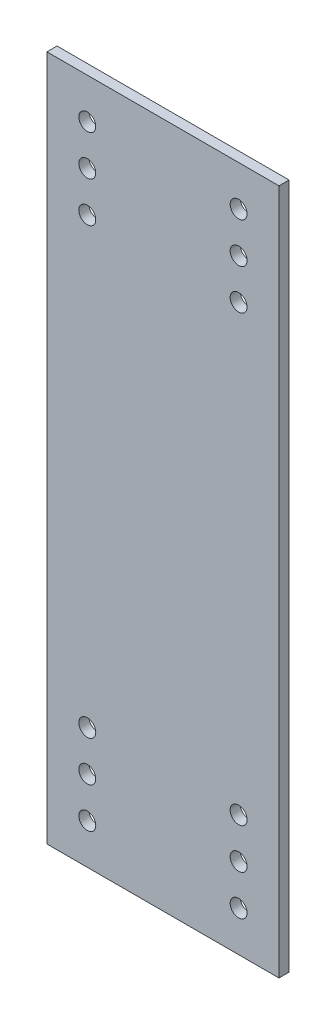
ISO-10303-21;
HEADER;
FILE_DESCRIPTION(('STEP AP214'),'2;1');
FILE_NAME('part.step','',(''),(''),'','','');
FILE_SCHEMA(('AUTOMOTIVE_DESIGN { 1 0 10303 214 1 1 1 1 }'));
ENDSEC;
DATA;
#1=APPLICATION_CONTEXT('core data for automotive mechanical design processes');
#2=APPLICATION_PROTOCOL_DEFINITION('international standard','automotive_design',2000,#1);
#3=PRODUCT_CONTEXT('',#1,'mechanical');
#4=PRODUCT('Part','Part','',(#3));
#5=PRODUCT_RELATED_PRODUCT_CATEGORY('part','',(#4));
#6=PRODUCT_DEFINITION_FORMATION('','',#4);
#7=PRODUCT_DEFINITION_CONTEXT('part definition',#1,'design');
#8=PRODUCT_DEFINITION('design','',#6,#7);
#9=PRODUCT_DEFINITION_SHAPE('','',#8);
#10=(LENGTH_UNIT() NAMED_UNIT(*) SI_UNIT(.MILLI.,.METRE.));
#11=(NAMED_UNIT(*) PLANE_ANGLE_UNIT() SI_UNIT($,.RADIAN.));
#12=(NAMED_UNIT(*) SI_UNIT($,.STERADIAN.) SOLID_ANGLE_UNIT());
#13=UNCERTAINTY_MEASURE_WITH_UNIT(LENGTH_MEASURE(1.E-05),#10,'distance_accuracy_value','');
#14=(GEOMETRIC_REPRESENTATION_CONTEXT(3) GLOBAL_UNCERTAINTY_ASSIGNED_CONTEXT((#13)) GLOBAL_UNIT_ASSIGNED_CONTEXT((#10,
#11,#12)) REPRESENTATION_CONTEXT('',''));
#15=CARTESIAN_POINT('',(0.,0.,0.));
#16=DIRECTION('',(0.,0.,1.));
#17=DIRECTION('',(1.,0.,0.));
#18=AXIS2_PLACEMENT_3D('',#15,#16,#17);
#19=CARTESIAN_POINT('',(36.5125,107.95,3.175));
#20=DIRECTION('',(-1.,0.,0.));
#21=DIRECTION('',(0.,-1.,0.));
#22=AXIS2_PLACEMENT_3D('',#19,#20,#21);
#23=PLANE('',#22);
#24=DIRECTION('',(0.,1.,0.));
#25=VECTOR('',#24,1.);
#26=CARTESIAN_POINT('',(36.5125,107.95,0.));
#27=LINE('',#26,#25);
#28=CARTESIAN_POINT('',(36.5125,-107.95,0.));
#29=VERTEX_POINT('',#28);
#30=CARTESIAN_POINT('',(36.5125,107.95,0.));
#31=VERTEX_POINT('',#30);
#32=EDGE_CURVE('E103',#29,#31,#27,.T.);
#33=ORIENTED_EDGE('',*,*,#32,.T.);
#34=DIRECTION('',(0.,0.,-1.));
#35=VECTOR('',#34,1.);
#36=CARTESIAN_POINT('',(36.5125,107.95,3.175));
#37=LINE('',#36,#35);
#38=CARTESIAN_POINT('',(36.5125,107.95,3.175));
#39=VERTEX_POINT('',#38);
#40=EDGE_CURVE('E11',#39,#31,#37,.T.);
#41=ORIENTED_EDGE('',*,*,#40,.F.);
#42=DIRECTION('',(0.,1.,0.));
#43=VECTOR('',#42,1.);
#44=CARTESIAN_POINT('',(36.5125,107.95,3.175));
#45=LINE('',#44,#43);
#46=CARTESIAN_POINT('',(36.5125,-107.95,3.175));
#47=VERTEX_POINT('',#46);
#48=EDGE_CURVE('E91',#47,#39,#45,.T.);
#49=ORIENTED_EDGE('',*,*,#48,.F.);
#50=DIRECTION('',(0.,0.,-1.));
#51=VECTOR('',#50,1.);
#52=CARTESIAN_POINT('',(36.5125,-107.95,3.175));
#53=LINE('',#52,#51);
#54=EDGE_CURVE('E99',#47,#29,#53,.T.);
#55=ORIENTED_EDGE('',*,*,#54,.T.);
#56=EDGE_LOOP('',(#33,#41,#49,#55));
#57=FACE_BOUND('',#56,.T.);
#58=ADVANCED_FACE('F40',(#57),#23,.F.);
#59=CARTESIAN_POINT('',(-36.5125,107.95,3.175));
#60=DIRECTION('',(0.,-1.,0.));
#61=DIRECTION('',(0.,0.,-1.));
#62=AXIS2_PLACEMENT_3D('',#59,#60,#61);
#63=PLANE('',#62);
#64=DIRECTION('',(-1.,0.,0.));
#65=VECTOR('',#64,1.);
#66=CARTESIAN_POINT('',(-36.5125,107.95,0.));
#67=LINE('',#66,#65);
#68=CARTESIAN_POINT('',(-36.5125,107.95,0.));
#69=VERTEX_POINT('',#68);
#70=EDGE_CURVE('E95',#31,#69,#67,.T.);
#71=ORIENTED_EDGE('',*,*,#70,.T.);
#72=DIRECTION('',(0.,0.,-1.));
#73=VECTOR('',#72,1.);
#74=CARTESIAN_POINT('',(-36.5125,107.95,3.175));
#75=LINE('',#74,#73);
#76=CARTESIAN_POINT('',(-36.5125,107.95,3.175));
#77=VERTEX_POINT('',#76);
#78=EDGE_CURVE('E48',#77,#69,#75,.T.);
#79=ORIENTED_EDGE('',*,*,#78,.F.);
#80=DIRECTION('',(-1.,0.,0.));
#81=VECTOR('',#80,1.);
#82=CARTESIAN_POINT('',(-36.5125,107.95,3.175));
#83=LINE('',#82,#81);
#84=EDGE_CURVE('E86',#39,#77,#83,.T.);
#85=ORIENTED_EDGE('',*,*,#84,.F.);
#86=ORIENTED_EDGE('',*,*,#40,.T.);
#87=EDGE_LOOP('',(#71,#79,#85,#86));
#88=FACE_BOUND('',#87,.T.);
#89=ADVANCED_FACE('F94',(#88),#63,.F.);
#90=CARTESIAN_POINT('',(-36.5125,107.95,3.175));
#91=DIRECTION('',(1.,0.,0.));
#92=DIRECTION('',(0.,1.,0.));
#93=AXIS2_PLACEMENT_3D('',#90,#91,#92);
#94=PLANE('',#93);
#95=DIRECTION('',(0.,-1.,0.));
#96=VECTOR('',#95,1.);
#97=CARTESIAN_POINT('',(-36.5125,107.95,0.));
#98=LINE('',#97,#96);
#99=CARTESIAN_POINT('',(-36.5125,-107.95,0.));
#100=VERTEX_POINT('',#99);
#101=EDGE_CURVE('E73',#69,#100,#98,.T.);
#102=ORIENTED_EDGE('',*,*,#101,.T.);
#103=DIRECTION('',(0.,0.,-1.));
#104=VECTOR('',#103,1.);
#105=CARTESIAN_POINT('',(-36.5125,-107.95,3.175));
#106=LINE('',#105,#104);
#107=CARTESIAN_POINT('',(-36.5125,-107.95,3.175));
#108=VERTEX_POINT('',#107);
#109=EDGE_CURVE('E96',#108,#100,#106,.T.);
#110=ORIENTED_EDGE('',*,*,#109,.F.);
#111=DIRECTION('',(0.,-1.,0.));
#112=VECTOR('',#111,1.);
#113=CARTESIAN_POINT('',(-36.5125,107.95,3.175));
#114=LINE('',#113,#112);
#115=EDGE_CURVE('E89',#77,#108,#114,.T.);
#116=ORIENTED_EDGE('',*,*,#115,.F.);
#117=ORIENTED_EDGE('',*,*,#78,.T.);
#118=EDGE_LOOP('',(#102,#110,#116,#117));
#119=FACE_BOUND('',#118,.T.);
#120=ADVANCED_FACE('F97',(#119),#94,.F.);
#121=CARTESIAN_POINT('',(-36.5125,-107.95,3.175));
#122=DIRECTION('',(0.,1.,0.));
#123=DIRECTION('',(0.,0.,1.));
#124=AXIS2_PLACEMENT_3D('',#121,#122,#123);
#125=PLANE('',#124);
#126=DIRECTION('',(1.,0.,0.));
#127=VECTOR('',#126,1.);
#128=CARTESIAN_POINT('',(-36.5125,-107.95,0.));
#129=LINE('',#128,#127);
#130=EDGE_CURVE('E79',#100,#29,#129,.T.);
#131=ORIENTED_EDGE('',*,*,#130,.T.);
#132=ORIENTED_EDGE('',*,*,#54,.F.);
#133=DIRECTION('',(1.,0.,0.));
#134=VECTOR('',#133,1.);
#135=CARTESIAN_POINT('',(-36.5125,-107.95,3.175));
#136=LINE('',#135,#134);
#137=EDGE_CURVE('E56',#108,#47,#136,.T.);
#138=ORIENTED_EDGE('',*,*,#137,.F.);
#139=ORIENTED_EDGE('',*,*,#109,.T.);
#140=EDGE_LOOP('',(#131,#132,#138,#139));
#141=FACE_BOUND('',#140,.T.);
#142=ADVANCED_FACE('F111',(#141),#125,.F.);
#143=CARTESIAN_POINT('',(0.,0.,3.175));
#144=DIRECTION('',(0.,0.,1.));
#145=DIRECTION('',(1.,0.,0.));
#146=AXIS2_PLACEMENT_3D('',#143,#144,#145);
#147=PLANE('',#146);
#148=CARTESIAN_POINT('',(-23.8125,69.85,3.175));
#149=DIRECTION('',(0.,0.,1.));
#150=DIRECTION('',(-1.,0.,0.));
#151=AXIS2_PLACEMENT_3D('',#148,#149,#150);
#152=CIRCLE('',#151,2.66700000000001);
#153=CARTESIAN_POINT('',(-26.4795,69.85,3.175));
#154=VERTEX_POINT('',#153);
#155=EDGE_CURVE('E127',#154,#154,#152,.T.);
#156=ORIENTED_EDGE('',*,*,#155,.F.);
#157=EDGE_LOOP('',(#156));
#158=FACE_BOUND('',#157,.T.);
#159=CARTESIAN_POINT('',(23.8125,95.25,3.175));
#160=DIRECTION('',(0.,0.,1.));
#161=DIRECTION('',(1.,0.,0.));
#162=AXIS2_PLACEMENT_3D('',#159,#160,#161);
#163=CIRCLE('',#162,2.66700000000001);
#164=CARTESIAN_POINT('',(26.4795,95.25,3.175));
#165=VERTEX_POINT('',#164);
#166=EDGE_CURVE('E150',#165,#165,#163,.T.);
#167=ORIENTED_EDGE('',*,*,#166,.F.);
#168=EDGE_LOOP('',(#167));
#169=FACE_BOUND('',#168,.T.);
#170=CARTESIAN_POINT('',(23.8125,82.55,3.175));
#171=DIRECTION('',(0.,0.,1.));
#172=DIRECTION('',(1.,0.,0.));
#173=AXIS2_PLACEMENT_3D('',#170,#171,#172);
#174=CIRCLE('',#173,2.66700000000001);
#175=CARTESIAN_POINT('',(26.4795,82.55,3.175));
#176=VERTEX_POINT('',#175);
#177=EDGE_CURVE('E151',#176,#176,#174,.T.);
#178=ORIENTED_EDGE('',*,*,#177,.F.);
#179=EDGE_LOOP('',(#178));
#180=FACE_BOUND('',#179,.T.);
#181=CARTESIAN_POINT('',(23.8125,69.85,3.175));
#182=DIRECTION('',(0.,0.,1.));
#183=DIRECTION('',(1.,0.,0.));
#184=AXIS2_PLACEMENT_3D('',#181,#182,#183);
#185=CIRCLE('',#184,2.66700000000001);
#186=CARTESIAN_POINT('',(26.4795,69.85,3.175));
#187=VERTEX_POINT('',#186);
#188=EDGE_CURVE('E162',#187,#187,#185,.T.);
#189=ORIENTED_EDGE('',*,*,#188,.F.);
#190=EDGE_LOOP('',(#189));
#191=FACE_BOUND('',#190,.T.);
#192=CARTESIAN_POINT('',(-23.8125,82.55,3.175));
#193=DIRECTION('',(0.,0.,1.));
#194=DIRECTION('',(-1.,0.,0.));
#195=AXIS2_PLACEMENT_3D('',#192,#193,#194);
#196=CIRCLE('',#195,2.66700000000001);
#197=CARTESIAN_POINT('',(-26.4795,82.55,3.175));
#198=VERTEX_POINT('',#197);
#199=EDGE_CURVE('E126',#198,#198,#196,.T.);
#200=ORIENTED_EDGE('',*,*,#199,.F.);
#201=EDGE_LOOP('',(#200));
#202=FACE_BOUND('',#201,.T.);
#203=CARTESIAN_POINT('',(-23.8125,95.25,3.175));
#204=DIRECTION('',(0.,0.,1.));
#205=DIRECTION('',(-1.,0.,0.));
#206=AXIS2_PLACEMENT_3D('',#203,#204,#205);
#207=CIRCLE('',#206,2.66700000000001);
#208=CARTESIAN_POINT('',(-26.4795,95.25,3.175));
#209=VERTEX_POINT('',#208);
#210=EDGE_CURVE('E133',#209,#209,#207,.T.);
#211=ORIENTED_EDGE('',*,*,#210,.F.);
#212=EDGE_LOOP('',(#211));
#213=FACE_BOUND('',#212,.T.);
#214=CARTESIAN_POINT('',(-23.8125,-95.25,3.175));
#215=DIRECTION('',(0.,0.,1.));
#216=DIRECTION('',(1.,0.,0.));
#217=AXIS2_PLACEMENT_3D('',#214,#215,#216);
#218=CIRCLE('',#217,2.66700000000001);
#219=CARTESIAN_POINT('',(-21.1455,-95.25,3.175));
#220=VERTEX_POINT('',#219);
#221=EDGE_CURVE('E139',#220,#220,#218,.T.);
#222=ORIENTED_EDGE('',*,*,#221,.F.);
#223=EDGE_LOOP('',(#222));
#224=FACE_BOUND('',#223,.T.);
#225=CARTESIAN_POINT('',(-23.8125,-82.55,3.175));
#226=DIRECTION('',(0.,0.,1.));
#227=DIRECTION('',(1.,0.,0.));
#228=AXIS2_PLACEMENT_3D('',#225,#226,#227);
#229=CIRCLE('',#228,2.66700000000001);
#230=CARTESIAN_POINT('',(-21.1455,-82.55,3.175));
#231=VERTEX_POINT('',#230);
#232=EDGE_CURVE('E120',#231,#231,#229,.T.);
#233=ORIENTED_EDGE('',*,*,#232,.F.);
#234=EDGE_LOOP('',(#233));
#235=FACE_BOUND('',#234,.T.);
#236=CARTESIAN_POINT('',(23.8125,-95.25,3.175));
#237=DIRECTION('',(0.,0.,1.));
#238=DIRECTION('',(-1.,0.,0.));
#239=AXIS2_PLACEMENT_3D('',#236,#237,#238);
#240=CIRCLE('',#239,2.66700000000001);
#241=CARTESIAN_POINT('',(21.1455,-95.25,3.175));
#242=VERTEX_POINT('',#241);
#243=EDGE_CURVE('E163',#242,#242,#240,.T.);
#244=ORIENTED_EDGE('',*,*,#243,.F.);
#245=EDGE_LOOP('',(#244));
#246=FACE_BOUND('',#245,.T.);
#247=CARTESIAN_POINT('',(23.8125,-82.55,3.175));
#248=DIRECTION('',(0.,0.,1.));
#249=DIRECTION('',(-1.,0.,0.));
#250=AXIS2_PLACEMENT_3D('',#247,#248,#249);
#251=CIRCLE('',#250,2.66700000000001);
#252=CARTESIAN_POINT('',(21.1455,-82.55,3.175));
#253=VERTEX_POINT('',#252);
#254=EDGE_CURVE('E180',#253,#253,#251,.T.);
#255=ORIENTED_EDGE('',*,*,#254,.F.);
#256=EDGE_LOOP('',(#255));
#257=FACE_BOUND('',#256,.T.);
#258=CARTESIAN_POINT('',(23.8125,-69.85,3.175));
#259=DIRECTION('',(0.,0.,1.));
#260=DIRECTION('',(-1.,0.,0.));
#261=AXIS2_PLACEMENT_3D('',#258,#259,#260);
#262=CIRCLE('',#261,2.66700000000001);
#263=CARTESIAN_POINT('',(21.1455,-69.85,3.175));
#264=VERTEX_POINT('',#263);
#265=EDGE_CURVE('E174',#264,#264,#262,.T.);
#266=ORIENTED_EDGE('',*,*,#265,.F.);
#267=EDGE_LOOP('',(#266));
#268=FACE_BOUND('',#267,.T.);
#269=CARTESIAN_POINT('',(-23.8125,-69.85,3.175));
#270=DIRECTION('',(0.,0.,1.));
#271=DIRECTION('',(1.,0.,0.));
#272=AXIS2_PLACEMENT_3D('',#269,#270,#271);
#273=CIRCLE('',#272,2.66700000000001);
#274=CARTESIAN_POINT('',(-21.1455,-69.85,3.175));
#275=VERTEX_POINT('',#274);
#276=EDGE_CURVE('E117',#275,#275,#273,.T.);
#277=ORIENTED_EDGE('',*,*,#276,.F.);
#278=EDGE_LOOP('',(#277));
#279=FACE_BOUND('',#278,.T.);
#280=ORIENTED_EDGE('',*,*,#48,.T.);
#281=ORIENTED_EDGE('',*,*,#84,.T.);
#282=ORIENTED_EDGE('',*,*,#115,.T.);
#283=ORIENTED_EDGE('',*,*,#137,.T.);
#284=EDGE_LOOP('',(#280,#281,#282,#283));
#285=FACE_BOUND('',#284,.T.);
#286=ADVANCED_FACE('F87',(#158,#169,#180,#191,#202,#213,#224,#235,#246,#257,#268,#279,#285),
#147,.T.);
#287=CARTESIAN_POINT('',(0.,0.,0.));
#288=DIRECTION('',(0.,0.,1.));
#289=DIRECTION('',(1.,0.,0.));
#290=AXIS2_PLACEMENT_3D('',#287,#288,#289);
#291=PLANE('',#290);
#292=CARTESIAN_POINT('',(-23.8125,69.85,0.));
#293=DIRECTION('',(0.,0.,1.));
#294=DIRECTION('',(-1.,0.,0.));
#295=AXIS2_PLACEMENT_3D('',#292,#293,#294);
#296=CIRCLE('',#295,2.66700000000001);
#297=CARTESIAN_POINT('',(-26.4795,69.85,0.));
#298=VERTEX_POINT('',#297);
#299=EDGE_CURVE('E154',#298,#298,#296,.T.);
#300=ORIENTED_EDGE('',*,*,#299,.T.);
#301=EDGE_LOOP('',(#300));
#302=FACE_BOUND('',#301,.T.);
#303=CARTESIAN_POINT('',(23.8125,95.25,0.));
#304=DIRECTION('',(0.,0.,1.));
#305=DIRECTION('',(1.,0.,0.));
#306=AXIS2_PLACEMENT_3D('',#303,#304,#305);
#307=CIRCLE('',#306,2.66700000000001);
#308=CARTESIAN_POINT('',(26.4795,95.25,0.));
#309=VERTEX_POINT('',#308);
#310=EDGE_CURVE('E147',#309,#309,#307,.T.);
#311=ORIENTED_EDGE('',*,*,#310,.T.);
#312=EDGE_LOOP('',(#311));
#313=FACE_BOUND('',#312,.T.);
#314=CARTESIAN_POINT('',(23.8125,82.55,0.));
#315=DIRECTION('',(0.,0.,1.));
#316=DIRECTION('',(1.,0.,0.));
#317=AXIS2_PLACEMENT_3D('',#314,#315,#316);
#318=CIRCLE('',#317,2.66700000000001);
#319=CARTESIAN_POINT('',(26.4795,82.55,0.));
#320=VERTEX_POINT('',#319);
#321=EDGE_CURVE('E166',#320,#320,#318,.T.);
#322=ORIENTED_EDGE('',*,*,#321,.T.);
#323=EDGE_LOOP('',(#322));
#324=FACE_BOUND('',#323,.T.);
#325=CARTESIAN_POINT('',(23.8125,69.85,0.));
#326=DIRECTION('',(0.,0.,1.));
#327=DIRECTION('',(1.,0.,0.));
#328=AXIS2_PLACEMENT_3D('',#325,#326,#327);
#329=CIRCLE('',#328,2.66700000000001);
#330=CARTESIAN_POINT('',(26.4795,69.85,0.));
#331=VERTEX_POINT('',#330);
#332=EDGE_CURVE('E159',#331,#331,#329,.T.);
#333=ORIENTED_EDGE('',*,*,#332,.T.);
#334=EDGE_LOOP('',(#333));
#335=FACE_BOUND('',#334,.T.);
#336=CARTESIAN_POINT('',(-23.8125,82.55,0.));
#337=DIRECTION('',(0.,0.,1.));
#338=DIRECTION('',(-1.,0.,0.));
#339=AXIS2_PLACEMENT_3D('',#336,#337,#338);
#340=CIRCLE('',#339,2.66700000000001);
#341=CARTESIAN_POINT('',(-26.4795,82.55,0.));
#342=VERTEX_POINT('',#341);
#343=EDGE_CURVE('E123',#342,#342,#340,.T.);
#344=ORIENTED_EDGE('',*,*,#343,.T.);
#345=EDGE_LOOP('',(#344));
#346=FACE_BOUND('',#345,.T.);
#347=CARTESIAN_POINT('',(-23.8125,95.25,0.));
#348=DIRECTION('',(0.,0.,1.));
#349=DIRECTION('',(-1.,0.,0.));
#350=AXIS2_PLACEMENT_3D('',#347,#348,#349);
#351=CIRCLE('',#350,2.66700000000001);
#352=CARTESIAN_POINT('',(-26.4795,95.25,0.));
#353=VERTEX_POINT('',#352);
#354=EDGE_CURVE('E130',#353,#353,#351,.T.);
#355=ORIENTED_EDGE('',*,*,#354,.T.);
#356=EDGE_LOOP('',(#355));
#357=FACE_BOUND('',#356,.T.);
#358=CARTESIAN_POINT('',(-23.8125,-95.25,0.));
#359=DIRECTION('',(0.,0.,1.));
#360=DIRECTION('',(1.,0.,0.));
#361=AXIS2_PLACEMENT_3D('',#358,#359,#360);
#362=CIRCLE('',#361,2.66700000000001);
#363=CARTESIAN_POINT('',(-21.1455,-95.25,0.));
#364=VERTEX_POINT('',#363);
#365=EDGE_CURVE('E136',#364,#364,#362,.T.);
#366=ORIENTED_EDGE('',*,*,#365,.T.);
#367=EDGE_LOOP('',(#366));
#368=FACE_BOUND('',#367,.T.);
#369=CARTESIAN_POINT('',(-23.8125,-82.55,0.));
#370=DIRECTION('',(0.,0.,1.));
#371=DIRECTION('',(1.,0.,0.));
#372=AXIS2_PLACEMENT_3D('',#369,#370,#371);
#373=CIRCLE('',#372,2.66700000000001);
#374=CARTESIAN_POINT('',(-21.1455,-82.55,0.));
#375=VERTEX_POINT('',#374);
#376=EDGE_CURVE('E142',#375,#375,#373,.T.);
#377=ORIENTED_EDGE('',*,*,#376,.T.);
#378=EDGE_LOOP('',(#377));
#379=FACE_BOUND('',#378,.T.);
#380=CARTESIAN_POINT('',(23.8125,-95.25,0.));
#381=DIRECTION('',(0.,0.,1.));
#382=DIRECTION('',(-1.,0.,0.));
#383=AXIS2_PLACEMENT_3D('',#380,#381,#382);
#384=CIRCLE('',#383,2.66700000000001);
#385=CARTESIAN_POINT('',(21.1455,-95.25,0.));
#386=VERTEX_POINT('',#385);
#387=EDGE_CURVE('E183',#386,#386,#384,.T.);
#388=ORIENTED_EDGE('',*,*,#387,.T.);
#389=EDGE_LOOP('',(#388));
#390=FACE_BOUND('',#389,.T.);
#391=CARTESIAN_POINT('',(23.8125,-82.55,0.));
#392=DIRECTION('',(0.,0.,1.));
#393=DIRECTION('',(-1.,0.,0.));
#394=AXIS2_PLACEMENT_3D('',#391,#392,#393);
#395=CIRCLE('',#394,2.66700000000001);
#396=CARTESIAN_POINT('',(21.1455,-82.55,0.));
#397=VERTEX_POINT('',#396);
#398=EDGE_CURVE('E177',#397,#397,#395,.T.);
#399=ORIENTED_EDGE('',*,*,#398,.T.);
#400=EDGE_LOOP('',(#399));
#401=FACE_BOUND('',#400,.T.);
#402=CARTESIAN_POINT('',(23.8125,-69.85,0.));
#403=DIRECTION('',(0.,0.,1.));
#404=DIRECTION('',(-1.,0.,0.));
#405=AXIS2_PLACEMENT_3D('',#402,#403,#404);
#406=CIRCLE('',#405,2.66700000000001);
#407=CARTESIAN_POINT('',(21.1455,-69.85,0.));
#408=VERTEX_POINT('',#407);
#409=EDGE_CURVE('E171',#408,#408,#406,.T.);
#410=ORIENTED_EDGE('',*,*,#409,.T.);
#411=EDGE_LOOP('',(#410));
#412=FACE_BOUND('',#411,.T.);
#413=CARTESIAN_POINT('',(-23.8125,-69.85,0.));
#414=DIRECTION('',(0.,0.,1.));
#415=DIRECTION('',(1.,0.,0.));
#416=AXIS2_PLACEMENT_3D('',#413,#414,#415);
#417=CIRCLE('',#416,2.66700000000001);
#418=CARTESIAN_POINT('',(-21.1455,-69.85,0.));
#419=VERTEX_POINT('',#418);
#420=EDGE_CURVE('E106',#419,#419,#417,.T.);
#421=ORIENTED_EDGE('',*,*,#420,.T.);
#422=EDGE_LOOP('',(#421));
#423=FACE_BOUND('',#422,.T.);
#424=ORIENTED_EDGE('',*,*,#32,.F.);
#425=ORIENTED_EDGE('',*,*,#130,.F.);
#426=ORIENTED_EDGE('',*,*,#101,.F.);
#427=ORIENTED_EDGE('',*,*,#70,.F.);
#428=EDGE_LOOP('',(#424,#425,#426,#427));
#429=FACE_BOUND('',#428,.T.);
#430=ADVANCED_FACE('F114',(#302,#313,#324,#335,#346,#357,#368,#379,#390,#401,#412,#423,#429),
#291,.F.);
#431=CARTESIAN_POINT('',(-23.8125,-69.85,0.));
#432=DIRECTION('',(0.,0.,1.));
#433=DIRECTION('',(1.,0.,0.));
#434=AXIS2_PLACEMENT_3D('',#431,#432,#433);
#435=CYLINDRICAL_SURFACE('',#434,2.66700000000001);
#436=ORIENTED_EDGE('',*,*,#420,.F.);
#437=EDGE_LOOP('',(#436));
#438=FACE_BOUND('',#437,.T.);
#439=ORIENTED_EDGE('',*,*,#276,.T.);
#440=EDGE_LOOP('',(#439));
#441=FACE_BOUND('',#440,.T.);
#442=ADVANCED_FACE('F201',(#438,#441),#435,.F.);
#443=CARTESIAN_POINT('',(23.8125,-69.85,0.));
#444=DIRECTION('',(0.,0.,1.));
#445=DIRECTION('',(1.,0.,0.));
#446=AXIS2_PLACEMENT_3D('',#443,#444,#445);
#447=CYLINDRICAL_SURFACE('',#446,2.66700000000001);
#448=ORIENTED_EDGE('',*,*,#409,.F.);
#449=EDGE_LOOP('',(#448));
#450=FACE_BOUND('',#449,.T.);
#451=ORIENTED_EDGE('',*,*,#265,.T.);
#452=EDGE_LOOP('',(#451));
#453=FACE_BOUND('',#452,.T.);
#454=ADVANCED_FACE('F203',(#450,#453),#447,.F.);
#455=CARTESIAN_POINT('',(23.8125,-82.55,0.));
#456=DIRECTION('',(0.,0.,1.));
#457=DIRECTION('',(1.,0.,0.));
#458=AXIS2_PLACEMENT_3D('',#455,#456,#457);
#459=CYLINDRICAL_SURFACE('',#458,2.66700000000001);
#460=ORIENTED_EDGE('',*,*,#398,.F.);
#461=EDGE_LOOP('',(#460));
#462=FACE_BOUND('',#461,.T.);
#463=ORIENTED_EDGE('',*,*,#254,.T.);
#464=EDGE_LOOP('',(#463));
#465=FACE_BOUND('',#464,.T.);
#466=ADVANCED_FACE('F210',(#462,#465),#459,.F.);
#467=CARTESIAN_POINT('',(23.8125,-95.25,0.));
#468=DIRECTION('',(0.,0.,1.));
#469=DIRECTION('',(1.,0.,0.));
#470=AXIS2_PLACEMENT_3D('',#467,#468,#469);
#471=CYLINDRICAL_SURFACE('',#470,2.66700000000001);
#472=ORIENTED_EDGE('',*,*,#387,.F.);
#473=EDGE_LOOP('',(#472));
#474=FACE_BOUND('',#473,.T.);
#475=ORIENTED_EDGE('',*,*,#243,.T.);
#476=EDGE_LOOP('',(#475));
#477=FACE_BOUND('',#476,.T.);
#478=ADVANCED_FACE('F189',(#474,#477),#471,.F.);
#479=CARTESIAN_POINT('',(-23.8125,-82.55,0.));
#480=DIRECTION('',(0.,0.,1.));
#481=DIRECTION('',(1.,0.,0.));
#482=AXIS2_PLACEMENT_3D('',#479,#480,#481);
#483=CYLINDRICAL_SURFACE('',#482,2.66700000000001);
#484=ORIENTED_EDGE('',*,*,#376,.F.);
#485=EDGE_LOOP('',(#484));
#486=FACE_BOUND('',#485,.T.);
#487=ORIENTED_EDGE('',*,*,#232,.T.);
#488=EDGE_LOOP('',(#487));
#489=FACE_BOUND('',#488,.T.);
#490=ADVANCED_FACE('F270',(#486,#489),#483,.F.);
#491=CARTESIAN_POINT('',(-23.8125,-95.25,0.));
#492=DIRECTION('',(0.,0.,1.));
#493=DIRECTION('',(1.,0.,0.));
#494=AXIS2_PLACEMENT_3D('',#491,#492,#493);
#495=CYLINDRICAL_SURFACE('',#494,2.66700000000001);
#496=ORIENTED_EDGE('',*,*,#365,.F.);
#497=EDGE_LOOP('',(#496));
#498=FACE_BOUND('',#497,.T.);
#499=ORIENTED_EDGE('',*,*,#221,.T.);
#500=EDGE_LOOP('',(#499));
#501=FACE_BOUND('',#500,.T.);
#502=ADVANCED_FACE('F280',(#498,#501),#495,.F.);
#503=CARTESIAN_POINT('',(-23.8125,95.25,0.));
#504=DIRECTION('',(0.,0.,1.));
#505=DIRECTION('',(1.,0.,0.));
#506=AXIS2_PLACEMENT_3D('',#503,#504,#505);
#507=CYLINDRICAL_SURFACE('',#506,2.66700000000001);
#508=ORIENTED_EDGE('',*,*,#354,.F.);
#509=EDGE_LOOP('',(#508));
#510=FACE_BOUND('',#509,.T.);
#511=ORIENTED_EDGE('',*,*,#210,.T.);
#512=EDGE_LOOP('',(#511));
#513=FACE_BOUND('',#512,.T.);
#514=ADVANCED_FACE('F290',(#510,#513),#507,.F.);
#515=CARTESIAN_POINT('',(-23.8125,82.55,0.));
#516=DIRECTION('',(0.,0.,1.));
#517=DIRECTION('',(1.,0.,0.));
#518=AXIS2_PLACEMENT_3D('',#515,#516,#517);
#519=CYLINDRICAL_SURFACE('',#518,2.66700000000001);
#520=ORIENTED_EDGE('',*,*,#343,.F.);
#521=EDGE_LOOP('',(#520));
#522=FACE_BOUND('',#521,.T.);
#523=ORIENTED_EDGE('',*,*,#199,.T.);
#524=EDGE_LOOP('',(#523));
#525=FACE_BOUND('',#524,.T.);
#526=ADVANCED_FACE('F300',(#522,#525),#519,.F.);
#527=CARTESIAN_POINT('',(23.8125,69.85,0.));
#528=DIRECTION('',(0.,0.,1.));
#529=DIRECTION('',(1.,0.,0.));
#530=AXIS2_PLACEMENT_3D('',#527,#528,#529);
#531=CYLINDRICAL_SURFACE('',#530,2.66700000000001);
#532=ORIENTED_EDGE('',*,*,#332,.F.);
#533=EDGE_LOOP('',(#532));
#534=FACE_BOUND('',#533,.T.);
#535=ORIENTED_EDGE('',*,*,#188,.T.);
#536=EDGE_LOOP('',(#535));
#537=FACE_BOUND('',#536,.T.);
#538=ADVANCED_FACE('F310',(#534,#537),#531,.F.);
#539=CARTESIAN_POINT('',(23.8125,82.55,0.));
#540=DIRECTION('',(0.,0.,1.));
#541=DIRECTION('',(1.,0.,0.));
#542=AXIS2_PLACEMENT_3D('',#539,#540,#541);
#543=CYLINDRICAL_SURFACE('',#542,2.66700000000001);
#544=ORIENTED_EDGE('',*,*,#321,.F.);
#545=EDGE_LOOP('',(#544));
#546=FACE_BOUND('',#545,.T.);
#547=ORIENTED_EDGE('',*,*,#177,.T.);
#548=EDGE_LOOP('',(#547));
#549=FACE_BOUND('',#548,.T.);
#550=ADVANCED_FACE('F319',(#546,#549),#543,.F.);
#551=CARTESIAN_POINT('',(23.8125,95.25,0.));
#552=DIRECTION('',(0.,0.,1.));
#553=DIRECTION('',(1.,0.,0.));
#554=AXIS2_PLACEMENT_3D('',#551,#552,#553);
#555=CYLINDRICAL_SURFACE('',#554,2.66700000000001);
#556=ORIENTED_EDGE('',*,*,#310,.F.);
#557=EDGE_LOOP('',(#556));
#558=FACE_BOUND('',#557,.T.);
#559=ORIENTED_EDGE('',*,*,#166,.T.);
#560=EDGE_LOOP('',(#559));
#561=FACE_BOUND('',#560,.T.);
#562=ADVANCED_FACE('F329',(#558,#561),#555,.F.);
#563=CARTESIAN_POINT('',(-23.8125,69.85,0.));
#564=DIRECTION('',(0.,0.,1.));
#565=DIRECTION('',(1.,0.,0.));
#566=AXIS2_PLACEMENT_3D('',#563,#564,#565);
#567=CYLINDRICAL_SURFACE('',#566,2.66700000000001);
#568=ORIENTED_EDGE('',*,*,#299,.F.);
#569=EDGE_LOOP('',(#568));
#570=FACE_BOUND('',#569,.T.);
#571=ORIENTED_EDGE('',*,*,#155,.T.);
#572=EDGE_LOOP('',(#571));
#573=FACE_BOUND('',#572,.T.);
#574=ADVANCED_FACE('F339',(#570,#573),#567,.F.);
#575=CLOSED_SHELL('',(#58,#89,#120,#142,#286,#430,#442,#454,#466,#478,#490,#502,#514,#526,#538,
#550,#562,#574));
#576=MANIFOLD_SOLID_BREP('B2',#575);
#577=ADVANCED_BREP_SHAPE_REPRESENTATION('',(#18,#576),#14);
#578=SHAPE_DEFINITION_REPRESENTATION(#9,#577);
ENDSEC;
END-ISO-10303-21;
